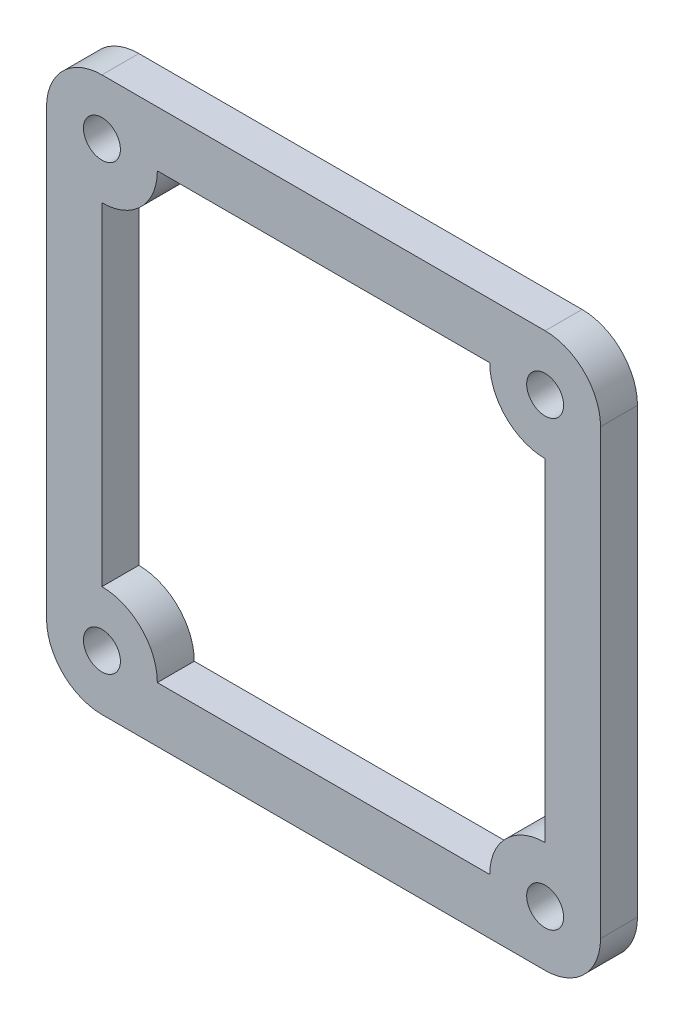
ISO-10303-21;
HEADER;
FILE_DESCRIPTION(('STEP AP214'),'2;1');
FILE_NAME('part.step','',(''),(''),'','','');
FILE_SCHEMA(('AUTOMOTIVE_DESIGN { 1 0 10303 214 1 1 1 1 }'));
ENDSEC;
DATA;
#1=APPLICATION_CONTEXT('core data for automotive mechanical design processes');
#2=APPLICATION_PROTOCOL_DEFINITION('international standard','automotive_design',2000,#1);
#3=PRODUCT_CONTEXT('',#1,'mechanical');
#4=PRODUCT('Part','Part','',(#3));
#5=PRODUCT_RELATED_PRODUCT_CATEGORY('part','',(#4));
#6=PRODUCT_DEFINITION_FORMATION('','',#4);
#7=PRODUCT_DEFINITION_CONTEXT('part definition',#1,'design');
#8=PRODUCT_DEFINITION('design','',#6,#7);
#9=PRODUCT_DEFINITION_SHAPE('','',#8);
#10=(LENGTH_UNIT() NAMED_UNIT(*) SI_UNIT(.MILLI.,.METRE.));
#11=(NAMED_UNIT(*) PLANE_ANGLE_UNIT() SI_UNIT($,.RADIAN.));
#12=(NAMED_UNIT(*) SI_UNIT($,.STERADIAN.) SOLID_ANGLE_UNIT());
#13=UNCERTAINTY_MEASURE_WITH_UNIT(LENGTH_MEASURE(1.E-05),#10,'distance_accuracy_value','');
#14=(GEOMETRIC_REPRESENTATION_CONTEXT(3) GLOBAL_UNCERTAINTY_ASSIGNED_CONTEXT((#13)) GLOBAL_UNIT_ASSIGNED_CONTEXT((#10,
#11,#12)) REPRESENTATION_CONTEXT('',''));
#15=CARTESIAN_POINT('',(0.,0.,0.));
#16=DIRECTION('',(0.,0.,1.));
#17=DIRECTION('',(1.,0.,0.));
#18=AXIS2_PLACEMENT_3D('',#15,#16,#17);
#19=CARTESIAN_POINT('',(-101.443383637,101.056539338,3.));
#20=DIRECTION('',(0.,0.,1.));
#21=DIRECTION('',(1.,0.,0.));
#22=AXIS2_PLACEMENT_3D('',#19,#20,#21);
#23=PLANE('',#22);
#24=CARTESIAN_POINT('',(-65.443383637,65.056539338,3.));
#25=DIRECTION('',(0.,0.,1.));
#26=DIRECTION('',(1.,0.,0.));
#27=AXIS2_PLACEMENT_3D('',#24,#25,#26);
#28=CIRCLE('',#27,1.5);
#29=CARTESIAN_POINT('',(-63.943383637,65.056539338,3.));
#30=VERTEX_POINT('',#29);
#31=EDGE_CURVE('E211',#30,#30,#28,.T.);
#32=ORIENTED_EDGE('',*,*,#31,.F.);
#33=EDGE_LOOP('',(#32));
#34=FACE_BOUND('',#33,.T.);
#35=CARTESIAN_POINT('',(-65.443383637,101.056539338,3.));
#36=DIRECTION('',(0.,0.,1.));
#37=DIRECTION('',(1.,0.,0.));
#38=AXIS2_PLACEMENT_3D('',#35,#36,#37);
#39=CIRCLE('',#38,1.5);
#40=CARTESIAN_POINT('',(-63.943383637,101.056539338,3.));
#41=VERTEX_POINT('',#40);
#42=EDGE_CURVE('E223',#41,#41,#39,.T.);
#43=ORIENTED_EDGE('',*,*,#42,.F.);
#44=EDGE_LOOP('',(#43));
#45=FACE_BOUND('',#44,.T.);
#46=CARTESIAN_POINT('',(-101.443383637,101.056539338,3.));
#47=DIRECTION('',(0.,0.,1.));
#48=DIRECTION('',(1.,0.,0.));
#49=AXIS2_PLACEMENT_3D('',#46,#47,#48);
#50=CIRCLE('',#49,4.5);
#51=CARTESIAN_POINT('',(-101.443383637,105.556539338,3.));
#52=VERTEX_POINT('',#51);
#53=CARTESIAN_POINT('',(-105.943383637,101.056539338,3.));
#54=VERTEX_POINT('',#53);
#55=EDGE_CURVE('E235',#52,#54,#50,.T.);
#56=ORIENTED_EDGE('',*,*,#55,.T.);
#57=DIRECTION('',(0.,-1.,0.));
#58=VECTOR('',#57,1.);
#59=CARTESIAN_POINT('',(-105.943383637,101.056539338,3.));
#60=LINE('',#59,#58);
#61=CARTESIAN_POINT('',(-105.943383637,65.056539338,3.));
#62=VERTEX_POINT('',#61);
#63=EDGE_CURVE('E238',#54,#62,#60,.T.);
#64=ORIENTED_EDGE('',*,*,#63,.T.);
#65=CARTESIAN_POINT('',(-101.443383637,65.056539338,3.));
#66=DIRECTION('',(0.,0.,1.));
#67=DIRECTION('',(1.,0.,0.));
#68=AXIS2_PLACEMENT_3D('',#65,#66,#67);
#69=CIRCLE('',#68,4.5);
#70=CARTESIAN_POINT('',(-101.443383637,60.556539338,3.));
#71=VERTEX_POINT('',#70);
#72=EDGE_CURVE('E241',#62,#71,#69,.T.);
#73=ORIENTED_EDGE('',*,*,#72,.T.);
#74=DIRECTION('',(1.,0.,0.));
#75=VECTOR('',#74,1.);
#76=CARTESIAN_POINT('',(-101.443383637,60.556539338,3.));
#77=LINE('',#76,#75);
#78=CARTESIAN_POINT('',(-65.443383637,60.556539338,3.));
#79=VERTEX_POINT('',#78);
#80=EDGE_CURVE('E243',#71,#79,#77,.T.);
#81=ORIENTED_EDGE('',*,*,#80,.T.);
#82=CARTESIAN_POINT('',(-65.443383637,65.056539338,3.));
#83=DIRECTION('',(0.,0.,1.));
#84=DIRECTION('',(1.,0.,0.));
#85=AXIS2_PLACEMENT_3D('',#82,#83,#84);
#86=CIRCLE('',#85,4.5);
#87=CARTESIAN_POINT('',(-60.943383637,65.056539338,3.));
#88=VERTEX_POINT('',#87);
#89=EDGE_CURVE('E245',#79,#88,#86,.T.);
#90=ORIENTED_EDGE('',*,*,#89,.T.);
#91=DIRECTION('',(0.,1.,0.));
#92=VECTOR('',#91,1.);
#93=CARTESIAN_POINT('',(-60.943383637,65.056539338,3.));
#94=LINE('',#93,#92);
#95=CARTESIAN_POINT('',(-60.943383637,101.056539338,3.));
#96=VERTEX_POINT('',#95);
#97=EDGE_CURVE('E247',#88,#96,#94,.T.);
#98=ORIENTED_EDGE('',*,*,#97,.T.);
#99=CARTESIAN_POINT('',(-65.443383637,101.056539338,3.));
#100=DIRECTION('',(0.,0.,1.));
#101=DIRECTION('',(1.,0.,0.));
#102=AXIS2_PLACEMENT_3D('',#99,#100,#101);
#103=CIRCLE('',#102,4.5);
#104=CARTESIAN_POINT('',(-65.443383637,105.556539338,3.));
#105=VERTEX_POINT('',#104);
#106=EDGE_CURVE('E249',#96,#105,#103,.T.);
#107=ORIENTED_EDGE('',*,*,#106,.T.);
#108=DIRECTION('',(-1.,0.,0.));
#109=VECTOR('',#108,1.);
#110=CARTESIAN_POINT('',(-65.443383637,105.556539338,3.));
#111=LINE('',#110,#109);
#112=EDGE_CURVE('E251',#105,#52,#111,.T.);
#113=ORIENTED_EDGE('',*,*,#112,.T.);
#114=EDGE_LOOP('',(#56,#64,#73,#81,#90,#98,#107,#113));
#115=FACE_BOUND('',#114,.T.);
#116=CARTESIAN_POINT('',(-101.443383637,101.056539338,3.));
#117=DIRECTION('',(0.,0.,1.));
#118=DIRECTION('',(1.,0.,0.));
#119=AXIS2_PLACEMENT_3D('',#116,#117,#118);
#120=CIRCLE('',#119,1.5);
#121=CARTESIAN_POINT('',(-99.943383637,101.056539338,3.));
#122=VERTEX_POINT('',#121);
#123=EDGE_CURVE('E229',#122,#122,#120,.T.);
#124=ORIENTED_EDGE('',*,*,#123,.F.);
#125=EDGE_LOOP('',(#124));
#126=FACE_BOUND('',#125,.T.);
#127=CARTESIAN_POINT('',(-101.443383637,65.056539338,3.));
#128=DIRECTION('',(0.,0.,1.));
#129=DIRECTION('',(1.,0.,0.));
#130=AXIS2_PLACEMENT_3D('',#127,#128,#129);
#131=CIRCLE('',#130,1.5);
#132=CARTESIAN_POINT('',(-99.943383637,65.056539338,3.));
#133=VERTEX_POINT('',#132);
#134=EDGE_CURVE('E217',#133,#133,#131,.T.);
#135=ORIENTED_EDGE('',*,*,#134,.F.);
#136=EDGE_LOOP('',(#135));
#137=FACE_BOUND('',#136,.T.);
#138=DIRECTION('',(0.,-1.,0.));
#139=VECTOR('',#138,1.);
#140=CARTESIAN_POINT('',(-101.443383637,96.556539338,3.));
#141=LINE('',#140,#139);
#142=CARTESIAN_POINT('',(-101.443383637,96.556539338,3.));
#143=VERTEX_POINT('',#142);
#144=CARTESIAN_POINT('',(-101.443383637,69.556539338,3.));
#145=VERTEX_POINT('',#144);
#146=EDGE_CURVE('E154',#143,#145,#141,.T.);
#147=ORIENTED_EDGE('',*,*,#146,.F.);
#148=CARTESIAN_POINT('',(-101.443383637,101.056539338,3.));
#149=DIRECTION('',(0.,0.,-1.));
#150=DIRECTION('',(1.,0.,0.));
#151=AXIS2_PLACEMENT_3D('',#148,#149,#150);
#152=CIRCLE('',#151,4.49999999999999);
#153=CARTESIAN_POINT('',(-96.943383637,101.056539338,3.));
#154=VERTEX_POINT('',#153);
#155=EDGE_CURVE('E146',#154,#143,#152,.T.);
#156=ORIENTED_EDGE('',*,*,#155,.F.);
#157=DIRECTION('',(-1.,0.,0.));
#158=VECTOR('',#157,1.);
#159=CARTESIAN_POINT('',(-69.943383637,101.056539338,3.));
#160=LINE('',#159,#158);
#161=CARTESIAN_POINT('',(-69.943383637,101.056539338,3.));
#162=VERTEX_POINT('',#161);
#163=EDGE_CURVE('E179',#162,#154,#160,.T.);
#164=ORIENTED_EDGE('',*,*,#163,.F.);
#165=CARTESIAN_POINT('',(-65.443383637,101.056539338,3.));
#166=DIRECTION('',(0.,0.,-1.));
#167=DIRECTION('',(1.,0.,0.));
#168=AXIS2_PLACEMENT_3D('',#165,#166,#167);
#169=CIRCLE('',#168,4.49999999999999);
#170=CARTESIAN_POINT('',(-65.443383637,96.556539338,3.));
#171=VERTEX_POINT('',#170);
#172=EDGE_CURVE('E177',#171,#162,#169,.T.);
#173=ORIENTED_EDGE('',*,*,#172,.F.);
#174=DIRECTION('',(0.,1.,0.));
#175=VECTOR('',#174,1.);
#176=CARTESIAN_POINT('',(-65.443383637,69.556539338,3.));
#177=LINE('',#176,#175);
#178=CARTESIAN_POINT('',(-65.443383637,69.556539338,3.));
#179=VERTEX_POINT('',#178);
#180=EDGE_CURVE('E175',#179,#171,#177,.T.);
#181=ORIENTED_EDGE('',*,*,#180,.F.);
#182=CARTESIAN_POINT('',(-65.443383637,65.056539338,3.));
#183=DIRECTION('',(0.,0.,-1.));
#184=DIRECTION('',(1.,0.,0.));
#185=AXIS2_PLACEMENT_3D('',#182,#183,#184);
#186=CIRCLE('',#185,4.49999999999999);
#187=CARTESIAN_POINT('',(-69.943383637,65.056539338,3.));
#188=VERTEX_POINT('',#187);
#189=EDGE_CURVE('E173',#188,#179,#186,.T.);
#190=ORIENTED_EDGE('',*,*,#189,.F.);
#191=DIRECTION('',(1.,0.,0.));
#192=VECTOR('',#191,1.);
#193=CARTESIAN_POINT('',(-96.943383637,65.056539338,3.));
#194=LINE('',#193,#192);
#195=CARTESIAN_POINT('',(-96.943383637,65.056539338,3.));
#196=VERTEX_POINT('',#195);
#197=EDGE_CURVE('E169',#196,#188,#194,.T.);
#198=ORIENTED_EDGE('',*,*,#197,.F.);
#199=CARTESIAN_POINT('',(-101.443383637,65.056539338,3.));
#200=DIRECTION('',(0.,0.,-1.));
#201=DIRECTION('',(1.,0.,0.));
#202=AXIS2_PLACEMENT_3D('',#199,#200,#201);
#203=CIRCLE('',#202,4.49999999999999);
#204=EDGE_CURVE('E167',#145,#196,#203,.T.);
#205=ORIENTED_EDGE('',*,*,#204,.F.);
#206=EDGE_LOOP('',(#147,#156,#164,#173,#181,#190,#198,#205));
#207=FACE_BOUND('',#206,.T.);
#208=ADVANCED_FACE('F33',(#34,#45,#115,#126,#137,#207),#23,.T.);
#209=CARTESIAN_POINT('',(-101.443383637,101.056539338,0.));
#210=DIRECTION('',(0.,0.,1.));
#211=DIRECTION('',(1.,0.,0.));
#212=AXIS2_PLACEMENT_3D('',#209,#210,#211);
#213=PLANE('',#212);
#214=CARTESIAN_POINT('',(-65.443383637,65.056539338,0.));
#215=DIRECTION('',(0.,0.,1.));
#216=DIRECTION('',(1.,0.,0.));
#217=AXIS2_PLACEMENT_3D('',#214,#215,#216);
#218=CIRCLE('',#217,1.5);
#219=CARTESIAN_POINT('',(-63.943383637,65.056539338,0.));
#220=VERTEX_POINT('',#219);
#221=EDGE_CURVE('E162',#220,#220,#218,.T.);
#222=ORIENTED_EDGE('',*,*,#221,.T.);
#223=EDGE_LOOP('',(#222));
#224=FACE_BOUND('',#223,.T.);
#225=CARTESIAN_POINT('',(-65.443383637,101.056539338,0.));
#226=DIRECTION('',(0.,0.,1.));
#227=DIRECTION('',(1.,0.,0.));
#228=AXIS2_PLACEMENT_3D('',#225,#226,#227);
#229=CIRCLE('',#228,1.5);
#230=CARTESIAN_POINT('',(-63.943383637,101.056539338,0.));
#231=VERTEX_POINT('',#230);
#232=EDGE_CURVE('E220',#231,#231,#229,.T.);
#233=ORIENTED_EDGE('',*,*,#232,.T.);
#234=EDGE_LOOP('',(#233));
#235=FACE_BOUND('',#234,.T.);
#236=CARTESIAN_POINT('',(-101.443383637,101.056539338,0.));
#237=DIRECTION('',(0.,0.,1.));
#238=DIRECTION('',(1.,0.,0.));
#239=AXIS2_PLACEMENT_3D('',#236,#237,#238);
#240=CIRCLE('',#239,4.5);
#241=CARTESIAN_POINT('',(-101.443383637,105.556539338,0.));
#242=VERTEX_POINT('',#241);
#243=CARTESIAN_POINT('',(-105.943383637,101.056539338,0.));
#244=VERTEX_POINT('',#243);
#245=EDGE_CURVE('E232',#242,#244,#240,.T.);
#246=ORIENTED_EDGE('',*,*,#245,.F.);
#247=DIRECTION('',(-1.,0.,0.));
#248=VECTOR('',#247,1.);
#249=CARTESIAN_POINT('',(-65.443383637,105.556539338,0.));
#250=LINE('',#249,#248);
#251=CARTESIAN_POINT('',(-65.443383637,105.556539338,0.));
#252=VERTEX_POINT('',#251);
#253=EDGE_CURVE('E239',#252,#242,#250,.T.);
#254=ORIENTED_EDGE('',*,*,#253,.F.);
#255=CARTESIAN_POINT('',(-65.443383637,101.056539338,0.));
#256=DIRECTION('',(0.,0.,1.));
#257=DIRECTION('',(1.,0.,0.));
#258=AXIS2_PLACEMENT_3D('',#255,#256,#257);
#259=CIRCLE('',#258,4.5);
#260=CARTESIAN_POINT('',(-60.943383637,101.056539338,0.));
#261=VERTEX_POINT('',#260);
#262=EDGE_CURVE('E266',#261,#252,#259,.T.);
#263=ORIENTED_EDGE('',*,*,#262,.F.);
#264=DIRECTION('',(0.,1.,0.));
#265=VECTOR('',#264,1.);
#266=CARTESIAN_POINT('',(-60.943383637,65.056539338,0.));
#267=LINE('',#266,#265);
#268=CARTESIAN_POINT('',(-60.943383637,65.056539338,0.));
#269=VERTEX_POINT('',#268);
#270=EDGE_CURVE('E264',#269,#261,#267,.T.);
#271=ORIENTED_EDGE('',*,*,#270,.F.);
#272=CARTESIAN_POINT('',(-65.443383637,65.056539338,0.));
#273=DIRECTION('',(0.,0.,1.));
#274=DIRECTION('',(1.,0.,0.));
#275=AXIS2_PLACEMENT_3D('',#272,#273,#274);
#276=CIRCLE('',#275,4.5);
#277=CARTESIAN_POINT('',(-65.443383637,60.556539338,0.));
#278=VERTEX_POINT('',#277);
#279=EDGE_CURVE('E262',#278,#269,#276,.T.);
#280=ORIENTED_EDGE('',*,*,#279,.F.);
#281=DIRECTION('',(1.,0.,0.));
#282=VECTOR('',#281,1.);
#283=CARTESIAN_POINT('',(-101.443383637,60.556539338,0.));
#284=LINE('',#283,#282);
#285=CARTESIAN_POINT('',(-101.443383637,60.556539338,0.));
#286=VERTEX_POINT('',#285);
#287=EDGE_CURVE('E260',#286,#278,#284,.T.);
#288=ORIENTED_EDGE('',*,*,#287,.F.);
#289=CARTESIAN_POINT('',(-101.443383637,65.056539338,0.));
#290=DIRECTION('',(0.,0.,1.));
#291=DIRECTION('',(1.,0.,0.));
#292=AXIS2_PLACEMENT_3D('',#289,#290,#291);
#293=CIRCLE('',#292,4.5);
#294=CARTESIAN_POINT('',(-105.943383637,65.056539338,0.));
#295=VERTEX_POINT('',#294);
#296=EDGE_CURVE('E258',#295,#286,#293,.T.);
#297=ORIENTED_EDGE('',*,*,#296,.F.);
#298=DIRECTION('',(0.,-1.,0.));
#299=VECTOR('',#298,1.);
#300=CARTESIAN_POINT('',(-105.943383637,101.056539338,0.));
#301=LINE('',#300,#299);
#302=EDGE_CURVE('E256',#244,#295,#301,.T.);
#303=ORIENTED_EDGE('',*,*,#302,.F.);
#304=EDGE_LOOP('',(#246,#254,#263,#271,#280,#288,#297,#303));
#305=FACE_BOUND('',#304,.T.);
#306=CARTESIAN_POINT('',(-101.443383637,101.056539338,0.));
#307=DIRECTION('',(0.,0.,1.));
#308=DIRECTION('',(1.,0.,0.));
#309=AXIS2_PLACEMENT_3D('',#306,#307,#308);
#310=CIRCLE('',#309,1.5);
#311=CARTESIAN_POINT('',(-99.943383637,101.056539338,0.));
#312=VERTEX_POINT('',#311);
#313=EDGE_CURVE('E226',#312,#312,#310,.T.);
#314=ORIENTED_EDGE('',*,*,#313,.T.);
#315=EDGE_LOOP('',(#314));
#316=FACE_BOUND('',#315,.T.);
#317=CARTESIAN_POINT('',(-101.443383637,65.056539338,0.));
#318=DIRECTION('',(0.,0.,1.));
#319=DIRECTION('',(1.,0.,0.));
#320=AXIS2_PLACEMENT_3D('',#317,#318,#319);
#321=CIRCLE('',#320,1.5);
#322=CARTESIAN_POINT('',(-99.943383637,65.056539338,0.));
#323=VERTEX_POINT('',#322);
#324=EDGE_CURVE('E214',#323,#323,#321,.T.);
#325=ORIENTED_EDGE('',*,*,#324,.T.);
#326=EDGE_LOOP('',(#325));
#327=FACE_BOUND('',#326,.T.);
#328=CARTESIAN_POINT('',(-101.443383637,101.056539338,0.));
#329=DIRECTION('',(0.,0.,-1.));
#330=DIRECTION('',(1.,0.,0.));
#331=AXIS2_PLACEMENT_3D('',#328,#329,#330);
#332=CIRCLE('',#331,4.49999999999999);
#333=CARTESIAN_POINT('',(-96.943383637,101.056539338,0.));
#334=VERTEX_POINT('',#333);
#335=CARTESIAN_POINT('',(-101.443383637,96.556539338,0.));
#336=VERTEX_POINT('',#335);
#337=EDGE_CURVE('E56',#334,#336,#332,.T.);
#338=ORIENTED_EDGE('',*,*,#337,.T.);
#339=DIRECTION('',(0.,-1.,0.));
#340=VECTOR('',#339,1.);
#341=CARTESIAN_POINT('',(-101.443383637,96.556539338,0.));
#342=LINE('',#341,#340);
#343=CARTESIAN_POINT('',(-101.443383637,69.556539338,0.));
#344=VERTEX_POINT('',#343);
#345=EDGE_CURVE('E161',#336,#344,#342,.T.);
#346=ORIENTED_EDGE('',*,*,#345,.T.);
#347=CARTESIAN_POINT('',(-101.443383637,65.056539338,0.));
#348=DIRECTION('',(0.,0.,-1.));
#349=DIRECTION('',(1.,0.,0.));
#350=AXIS2_PLACEMENT_3D('',#347,#348,#349);
#351=CIRCLE('',#350,4.49999999999999);
#352=CARTESIAN_POINT('',(-96.943383637,65.056539338,0.));
#353=VERTEX_POINT('',#352);
#354=EDGE_CURVE('E183',#344,#353,#351,.T.);
#355=ORIENTED_EDGE('',*,*,#354,.T.);
#356=DIRECTION('',(1.,0.,0.));
#357=VECTOR('',#356,1.);
#358=CARTESIAN_POINT('',(-96.943383637,65.056539338,0.));
#359=LINE('',#358,#357);
#360=CARTESIAN_POINT('',(-69.943383637,65.056539338,0.));
#361=VERTEX_POINT('',#360);
#362=EDGE_CURVE('E186',#353,#361,#359,.T.);
#363=ORIENTED_EDGE('',*,*,#362,.T.);
#364=CARTESIAN_POINT('',(-65.443383637,65.056539338,0.));
#365=DIRECTION('',(0.,0.,-1.));
#366=DIRECTION('',(1.,0.,0.));
#367=AXIS2_PLACEMENT_3D('',#364,#365,#366);
#368=CIRCLE('',#367,4.49999999999999);
#369=CARTESIAN_POINT('',(-65.443383637,69.556539338,0.));
#370=VERTEX_POINT('',#369);
#371=EDGE_CURVE('E189',#361,#370,#368,.T.);
#372=ORIENTED_EDGE('',*,*,#371,.T.);
#373=DIRECTION('',(0.,1.,0.));
#374=VECTOR('',#373,1.);
#375=CARTESIAN_POINT('',(-65.443383637,69.556539338,0.));
#376=LINE('',#375,#374);
#377=CARTESIAN_POINT('',(-65.443383637,96.556539338,0.));
#378=VERTEX_POINT('',#377);
#379=EDGE_CURVE('E192',#370,#378,#376,.T.);
#380=ORIENTED_EDGE('',*,*,#379,.T.);
#381=CARTESIAN_POINT('',(-65.443383637,101.056539338,0.));
#382=DIRECTION('',(0.,0.,-1.));
#383=DIRECTION('',(1.,0.,0.));
#384=AXIS2_PLACEMENT_3D('',#381,#382,#383);
#385=CIRCLE('',#384,4.49999999999999);
#386=CARTESIAN_POINT('',(-69.943383637,101.056539338,0.));
#387=VERTEX_POINT('',#386);
#388=EDGE_CURVE('E195',#378,#387,#385,.T.);
#389=ORIENTED_EDGE('',*,*,#388,.T.);
#390=DIRECTION('',(-1.,0.,0.));
#391=VECTOR('',#390,1.);
#392=CARTESIAN_POINT('',(-69.943383637,101.056539338,0.));
#393=LINE('',#392,#391);
#394=EDGE_CURVE('E155',#387,#334,#393,.T.);
#395=ORIENTED_EDGE('',*,*,#394,.T.);
#396=EDGE_LOOP('',(#338,#346,#355,#363,#372,#380,#389,#395));
#397=FACE_BOUND('',#396,.T.);
#398=ADVANCED_FACE('F296',(#224,#235,#305,#316,#327,#397),#213,.F.);
#399=CARTESIAN_POINT('',(-101.443383637,101.056539338,3.));
#400=DIRECTION('',(0.,0.,-1.));
#401=DIRECTION('',(-1.,0.,0.));
#402=AXIS2_PLACEMENT_3D('',#399,#400,#401);
#403=CYLINDRICAL_SURFACE('',#402,4.5);
#404=ORIENTED_EDGE('',*,*,#245,.T.);
#405=DIRECTION('',(0.,0.,-1.));
#406=VECTOR('',#405,1.);
#407=CARTESIAN_POINT('',(-105.943383637,101.056539338,3.));
#408=LINE('',#407,#406);
#409=EDGE_CURVE('E11',#54,#244,#408,.T.);
#410=ORIENTED_EDGE('',*,*,#409,.F.);
#411=ORIENTED_EDGE('',*,*,#55,.F.);
#412=DIRECTION('',(0.,0.,-1.));
#413=VECTOR('',#412,1.);
#414=CARTESIAN_POINT('',(-101.443383637,105.556539338,3.));
#415=LINE('',#414,#413);
#416=EDGE_CURVE('E253',#52,#242,#415,.T.);
#417=ORIENTED_EDGE('',*,*,#416,.T.);
#418=EDGE_LOOP('',(#404,#410,#411,#417));
#419=FACE_BOUND('',#418,.T.);
#420=ADVANCED_FACE('F35',(#419),#403,.T.);
#421=CARTESIAN_POINT('',(-105.943383637,101.056539338,3.));
#422=DIRECTION('',(1.,0.,0.));
#423=DIRECTION('',(0.,0.,-1.));
#424=AXIS2_PLACEMENT_3D('',#421,#422,#423);
#425=PLANE('',#424);
#426=ORIENTED_EDGE('',*,*,#302,.T.);
#427=DIRECTION('',(0.,0.,-1.));
#428=VECTOR('',#427,1.);
#429=CARTESIAN_POINT('',(-105.943383637,65.056539338,3.));
#430=LINE('',#429,#428);
#431=EDGE_CURVE('E41',#62,#295,#430,.T.);
#432=ORIENTED_EDGE('',*,*,#431,.F.);
#433=ORIENTED_EDGE('',*,*,#63,.F.);
#434=ORIENTED_EDGE('',*,*,#409,.T.);
#435=EDGE_LOOP('',(#426,#432,#433,#434));
#436=FACE_BOUND('',#435,.T.);
#437=ADVANCED_FACE('F314',(#436),#425,.F.);
#438=CARTESIAN_POINT('',(-101.443383637,65.056539338,3.));
#439=DIRECTION('',(0.,0.,-1.));
#440=DIRECTION('',(-1.,0.,0.));
#441=AXIS2_PLACEMENT_3D('',#438,#439,#440);
#442=CYLINDRICAL_SURFACE('',#441,4.5);
#443=ORIENTED_EDGE('',*,*,#296,.T.);
#444=DIRECTION('',(0.,0.,-1.));
#445=VECTOR('',#444,1.);
#446=CARTESIAN_POINT('',(-101.443383637,60.556539338,3.));
#447=LINE('',#446,#445);
#448=EDGE_CURVE('E283',#71,#286,#447,.T.);
#449=ORIENTED_EDGE('',*,*,#448,.F.);
#450=ORIENTED_EDGE('',*,*,#72,.F.);
#451=ORIENTED_EDGE('',*,*,#431,.T.);
#452=EDGE_LOOP('',(#443,#449,#450,#451));
#453=FACE_BOUND('',#452,.T.);
#454=ADVANCED_FACE('F290',(#453),#442,.T.);
#455=CARTESIAN_POINT('',(-101.443383637,60.556539338,3.));
#456=DIRECTION('',(0.,1.,0.));
#457=DIRECTION('',(0.,0.,1.));
#458=AXIS2_PLACEMENT_3D('',#455,#456,#457);
#459=PLANE('',#458);
#460=ORIENTED_EDGE('',*,*,#287,.T.);
#461=DIRECTION('',(0.,0.,-1.));
#462=VECTOR('',#461,1.);
#463=CARTESIAN_POINT('',(-65.443383637,60.556539338,3.));
#464=LINE('',#463,#462);
#465=EDGE_CURVE('E280',#79,#278,#464,.T.);
#466=ORIENTED_EDGE('',*,*,#465,.F.);
#467=ORIENTED_EDGE('',*,*,#80,.F.);
#468=ORIENTED_EDGE('',*,*,#448,.T.);
#469=EDGE_LOOP('',(#460,#466,#467,#468));
#470=FACE_BOUND('',#469,.T.);
#471=ADVANCED_FACE('F302',(#470),#459,.F.);
#472=CARTESIAN_POINT('',(-65.443383637,65.056539338,3.));
#473=DIRECTION('',(0.,0.,-1.));
#474=DIRECTION('',(-1.,0.,0.));
#475=AXIS2_PLACEMENT_3D('',#472,#473,#474);
#476=CYLINDRICAL_SURFACE('',#475,4.5);
#477=ORIENTED_EDGE('',*,*,#279,.T.);
#478=DIRECTION('',(0.,0.,-1.));
#479=VECTOR('',#478,1.);
#480=CARTESIAN_POINT('',(-60.943383637,65.056539338,3.));
#481=LINE('',#480,#479);
#482=EDGE_CURVE('E277',#88,#269,#481,.T.);
#483=ORIENTED_EDGE('',*,*,#482,.F.);
#484=ORIENTED_EDGE('',*,*,#89,.F.);
#485=ORIENTED_EDGE('',*,*,#465,.T.);
#486=EDGE_LOOP('',(#477,#483,#484,#485));
#487=FACE_BOUND('',#486,.T.);
#488=ADVANCED_FACE('F306',(#487),#476,.T.);
#489=CARTESIAN_POINT('',(-60.943383637,65.056539338,3.));
#490=DIRECTION('',(-1.,0.,0.));
#491=DIRECTION('',(0.,0.,1.));
#492=AXIS2_PLACEMENT_3D('',#489,#490,#491);
#493=PLANE('',#492);
#494=ORIENTED_EDGE('',*,*,#270,.T.);
#495=DIRECTION('',(0.,0.,-1.));
#496=VECTOR('',#495,1.);
#497=CARTESIAN_POINT('',(-60.943383637,101.056539338,3.));
#498=LINE('',#497,#496);
#499=EDGE_CURVE('E274',#96,#261,#498,.T.);
#500=ORIENTED_EDGE('',*,*,#499,.F.);
#501=ORIENTED_EDGE('',*,*,#97,.F.);
#502=ORIENTED_EDGE('',*,*,#482,.T.);
#503=EDGE_LOOP('',(#494,#500,#501,#502));
#504=FACE_BOUND('',#503,.T.);
#505=ADVANCED_FACE('F327',(#504),#493,.F.);
#506=CARTESIAN_POINT('',(-65.443383637,101.056539338,3.));
#507=DIRECTION('',(0.,0.,-1.));
#508=DIRECTION('',(-1.,0.,0.));
#509=AXIS2_PLACEMENT_3D('',#506,#507,#508);
#510=CYLINDRICAL_SURFACE('',#509,4.5);
#511=ORIENTED_EDGE('',*,*,#262,.T.);
#512=DIRECTION('',(0.,0.,-1.));
#513=VECTOR('',#512,1.);
#514=CARTESIAN_POINT('',(-65.443383637,105.556539338,3.));
#515=LINE('',#514,#513);
#516=EDGE_CURVE('E271',#105,#252,#515,.T.);
#517=ORIENTED_EDGE('',*,*,#516,.F.);
#518=ORIENTED_EDGE('',*,*,#106,.F.);
#519=ORIENTED_EDGE('',*,*,#499,.T.);
#520=EDGE_LOOP('',(#511,#517,#518,#519));
#521=FACE_BOUND('',#520,.T.);
#522=ADVANCED_FACE('F325',(#521),#510,.T.);
#523=CARTESIAN_POINT('',(-65.443383637,105.556539338,3.));
#524=DIRECTION('',(0.,-1.,0.));
#525=DIRECTION('',(0.,0.,-1.));
#526=AXIS2_PLACEMENT_3D('',#523,#524,#525);
#527=PLANE('',#526);
#528=ORIENTED_EDGE('',*,*,#253,.T.);
#529=ORIENTED_EDGE('',*,*,#416,.F.);
#530=ORIENTED_EDGE('',*,*,#112,.F.);
#531=ORIENTED_EDGE('',*,*,#516,.T.);
#532=EDGE_LOOP('',(#528,#529,#530,#531));
#533=FACE_BOUND('',#532,.T.);
#534=ADVANCED_FACE('F320',(#533),#527,.F.);
#535=CARTESIAN_POINT('',(-101.443383637,101.056539338,3.));
#536=DIRECTION('',(0.,0.,-1.));
#537=DIRECTION('',(-1.,0.,0.));
#538=AXIS2_PLACEMENT_3D('',#535,#536,#537);
#539=CYLINDRICAL_SURFACE('',#538,1.5);
#540=ORIENTED_EDGE('',*,*,#123,.T.);
#541=EDGE_LOOP('',(#540));
#542=FACE_BOUND('',#541,.T.);
#543=ORIENTED_EDGE('',*,*,#313,.F.);
#544=EDGE_LOOP('',(#543));
#545=FACE_BOUND('',#544,.T.);
#546=ADVANCED_FACE('F347',(#542,#545),#539,.F.);
#547=CARTESIAN_POINT('',(-65.443383637,101.056539338,3.));
#548=DIRECTION('',(0.,0.,-1.));
#549=DIRECTION('',(-1.,0.,0.));
#550=AXIS2_PLACEMENT_3D('',#547,#548,#549);
#551=CYLINDRICAL_SURFACE('',#550,1.5);
#552=ORIENTED_EDGE('',*,*,#42,.T.);
#553=EDGE_LOOP('',(#552));
#554=FACE_BOUND('',#553,.T.);
#555=ORIENTED_EDGE('',*,*,#232,.F.);
#556=EDGE_LOOP('',(#555));
#557=FACE_BOUND('',#556,.T.);
#558=ADVANCED_FACE('F354',(#554,#557),#551,.F.);
#559=CARTESIAN_POINT('',(-101.443383637,65.056539338,3.));
#560=DIRECTION('',(0.,0.,-1.));
#561=DIRECTION('',(-1.,0.,0.));
#562=AXIS2_PLACEMENT_3D('',#559,#560,#561);
#563=CYLINDRICAL_SURFACE('',#562,1.5);
#564=ORIENTED_EDGE('',*,*,#134,.T.);
#565=EDGE_LOOP('',(#564));
#566=FACE_BOUND('',#565,.T.);
#567=ORIENTED_EDGE('',*,*,#324,.F.);
#568=EDGE_LOOP('',(#567));
#569=FACE_BOUND('',#568,.T.);
#570=ADVANCED_FACE('F359',(#566,#569),#563,.F.);
#571=CARTESIAN_POINT('',(-65.443383637,65.056539338,3.));
#572=DIRECTION('',(0.,0.,-1.));
#573=DIRECTION('',(-1.,0.,0.));
#574=AXIS2_PLACEMENT_3D('',#571,#572,#573);
#575=CYLINDRICAL_SURFACE('',#574,1.5);
#576=ORIENTED_EDGE('',*,*,#31,.T.);
#577=EDGE_LOOP('',(#576));
#578=FACE_BOUND('',#577,.T.);
#579=ORIENTED_EDGE('',*,*,#221,.F.);
#580=EDGE_LOOP('',(#579));
#581=FACE_BOUND('',#580,.T.);
#582=ADVANCED_FACE('F402',(#578,#581),#575,.F.);
#583=CARTESIAN_POINT('',(-101.443383637,101.056539338,3.));
#584=DIRECTION('',(0.,0.,-1.));
#585=DIRECTION('',(-1.,0.,0.));
#586=AXIS2_PLACEMENT_3D('',#583,#584,#585);
#587=CYLINDRICAL_SURFACE('',#586,4.49999999999999);
#588=ORIENTED_EDGE('',*,*,#337,.F.);
#589=DIRECTION('',(0.,0.,-1.));
#590=VECTOR('',#589,1.);
#591=CARTESIAN_POINT('',(-96.943383637,101.056539338,3.));
#592=LINE('',#591,#590);
#593=EDGE_CURVE('E150',#154,#334,#592,.T.);
#594=ORIENTED_EDGE('',*,*,#593,.F.);
#595=ORIENTED_EDGE('',*,*,#155,.T.);
#596=DIRECTION('',(0.,0.,-1.));
#597=VECTOR('',#596,1.);
#598=CARTESIAN_POINT('',(-101.443383637,96.556539338,3.));
#599=LINE('',#598,#597);
#600=EDGE_CURVE('E149',#143,#336,#599,.T.);
#601=ORIENTED_EDGE('',*,*,#600,.T.);
#602=EDGE_LOOP('',(#588,#594,#595,#601));
#603=FACE_BOUND('',#602,.T.);
#604=ADVANCED_FACE('F148',(#603),#587,.T.);
#605=CARTESIAN_POINT('',(-101.443383637,96.556539338,3.));
#606=DIRECTION('',(1.,0.,0.));
#607=DIRECTION('',(0.,0.,-1.));
#608=AXIS2_PLACEMENT_3D('',#605,#606,#607);
#609=PLANE('',#608);
#610=ORIENTED_EDGE('',*,*,#345,.F.);
#611=ORIENTED_EDGE('',*,*,#600,.F.);
#612=ORIENTED_EDGE('',*,*,#146,.T.);
#613=DIRECTION('',(0.,0.,-1.));
#614=VECTOR('',#613,1.);
#615=CARTESIAN_POINT('',(-101.443383637,69.556539338,3.));
#616=LINE('',#615,#614);
#617=EDGE_CURVE('E163',#145,#344,#616,.T.);
#618=ORIENTED_EDGE('',*,*,#617,.T.);
#619=EDGE_LOOP('',(#610,#611,#612,#618));
#620=FACE_BOUND('',#619,.T.);
#621=ADVANCED_FACE('F158',(#620),#609,.T.);
#622=CARTESIAN_POINT('',(-101.443383637,65.056539338,3.));
#623=DIRECTION('',(0.,0.,-1.));
#624=DIRECTION('',(-1.,0.,0.));
#625=AXIS2_PLACEMENT_3D('',#622,#623,#624);
#626=CYLINDRICAL_SURFACE('',#625,4.49999999999999);
#627=ORIENTED_EDGE('',*,*,#354,.F.);
#628=ORIENTED_EDGE('',*,*,#617,.F.);
#629=ORIENTED_EDGE('',*,*,#204,.T.);
#630=DIRECTION('',(0.,0.,-1.));
#631=VECTOR('',#630,1.);
#632=CARTESIAN_POINT('',(-96.943383637,65.056539338,3.));
#633=LINE('',#632,#631);
#634=EDGE_CURVE('E208',#196,#353,#633,.T.);
#635=ORIENTED_EDGE('',*,*,#634,.T.);
#636=EDGE_LOOP('',(#627,#628,#629,#635));
#637=FACE_BOUND('',#636,.T.);
#638=ADVANCED_FACE('F389',(#637),#626,.T.);
#639=CARTESIAN_POINT('',(-96.943383637,65.056539338,3.));
#640=DIRECTION('',(0.,1.,0.));
#641=DIRECTION('',(0.,0.,1.));
#642=AXIS2_PLACEMENT_3D('',#639,#640,#641);
#643=PLANE('',#642);
#644=ORIENTED_EDGE('',*,*,#362,.F.);
#645=ORIENTED_EDGE('',*,*,#634,.F.);
#646=ORIENTED_EDGE('',*,*,#197,.T.);
#647=DIRECTION('',(0.,0.,-1.));
#648=VECTOR('',#647,1.);
#649=CARTESIAN_POINT('',(-69.943383637,65.056539338,3.));
#650=LINE('',#649,#648);
#651=EDGE_CURVE('E206',#188,#361,#650,.T.);
#652=ORIENTED_EDGE('',*,*,#651,.T.);
#653=EDGE_LOOP('',(#644,#645,#646,#652));
#654=FACE_BOUND('',#653,.T.);
#655=ADVANCED_FACE('F386',(#654),#643,.T.);
#656=CARTESIAN_POINT('',(-65.443383637,65.056539338,3.));
#657=DIRECTION('',(0.,0.,-1.));
#658=DIRECTION('',(-1.,0.,0.));
#659=AXIS2_PLACEMENT_3D('',#656,#657,#658);
#660=CYLINDRICAL_SURFACE('',#659,4.49999999999999);
#661=ORIENTED_EDGE('',*,*,#371,.F.);
#662=ORIENTED_EDGE('',*,*,#651,.F.);
#663=ORIENTED_EDGE('',*,*,#189,.T.);
#664=DIRECTION('',(0.,0.,-1.));
#665=VECTOR('',#664,1.);
#666=CARTESIAN_POINT('',(-65.443383637,69.556539338,3.));
#667=LINE('',#666,#665);
#668=EDGE_CURVE('E204',#179,#370,#667,.T.);
#669=ORIENTED_EDGE('',*,*,#668,.T.);
#670=EDGE_LOOP('',(#661,#662,#663,#669));
#671=FACE_BOUND('',#670,.T.);
#672=ADVANCED_FACE('F381',(#671),#660,.T.);
#673=CARTESIAN_POINT('',(-65.443383637,69.556539338,3.));
#674=DIRECTION('',(-1.,0.,0.));
#675=DIRECTION('',(0.,0.,1.));
#676=AXIS2_PLACEMENT_3D('',#673,#674,#675);
#677=PLANE('',#676);
#678=ORIENTED_EDGE('',*,*,#379,.F.);
#679=ORIENTED_EDGE('',*,*,#668,.F.);
#680=ORIENTED_EDGE('',*,*,#180,.T.);
#681=DIRECTION('',(0.,0.,-1.));
#682=VECTOR('',#681,1.);
#683=CARTESIAN_POINT('',(-65.443383637,96.556539338,3.));
#684=LINE('',#683,#682);
#685=EDGE_CURVE('E202',#171,#378,#684,.T.);
#686=ORIENTED_EDGE('',*,*,#685,.T.);
#687=EDGE_LOOP('',(#678,#679,#680,#686));
#688=FACE_BOUND('',#687,.T.);
#689=ADVANCED_FACE('F377',(#688),#677,.T.);
#690=CARTESIAN_POINT('',(-65.443383637,101.056539338,3.));
#691=DIRECTION('',(0.,0.,-1.));
#692=DIRECTION('',(-1.,0.,0.));
#693=AXIS2_PLACEMENT_3D('',#690,#691,#692);
#694=CYLINDRICAL_SURFACE('',#693,4.49999999999999);
#695=ORIENTED_EDGE('',*,*,#388,.F.);
#696=ORIENTED_EDGE('',*,*,#685,.F.);
#697=ORIENTED_EDGE('',*,*,#172,.T.);
#698=DIRECTION('',(0.,0.,-1.));
#699=VECTOR('',#698,1.);
#700=CARTESIAN_POINT('',(-69.943383637,101.056539338,3.));
#701=LINE('',#700,#699);
#702=EDGE_CURVE('E48',#162,#387,#701,.T.);
#703=ORIENTED_EDGE('',*,*,#702,.T.);
#704=EDGE_LOOP('',(#695,#696,#697,#703));
#705=FACE_BOUND('',#704,.T.);
#706=ADVANCED_FACE('F374',(#705),#694,.T.);
#707=CARTESIAN_POINT('',(-69.943383637,101.056539338,3.));
#708=DIRECTION('',(0.,-1.,0.));
#709=DIRECTION('',(0.,0.,-1.));
#710=AXIS2_PLACEMENT_3D('',#707,#708,#709);
#711=PLANE('',#710);
#712=ORIENTED_EDGE('',*,*,#394,.F.);
#713=ORIENTED_EDGE('',*,*,#702,.F.);
#714=ORIENTED_EDGE('',*,*,#163,.T.);
#715=ORIENTED_EDGE('',*,*,#593,.T.);
#716=EDGE_LOOP('',(#712,#713,#714,#715));
#717=FACE_BOUND('',#716,.T.);
#718=ADVANCED_FACE('F368',(#717),#711,.T.);
#719=CLOSED_SHELL('',(#208,#398,#420,#437,#454,#471,#488,#505,#522,#534,#546,#558,#570,#582,
#604,#621,#638,#655,#672,#689,#706,#718));
#720=MANIFOLD_SOLID_BREP('B2',#719);
#721=ADVANCED_BREP_SHAPE_REPRESENTATION('',(#18,#720),#14);
#722=SHAPE_DEFINITION_REPRESENTATION(#9,#721);
ENDSEC;
END-ISO-10303-21;
